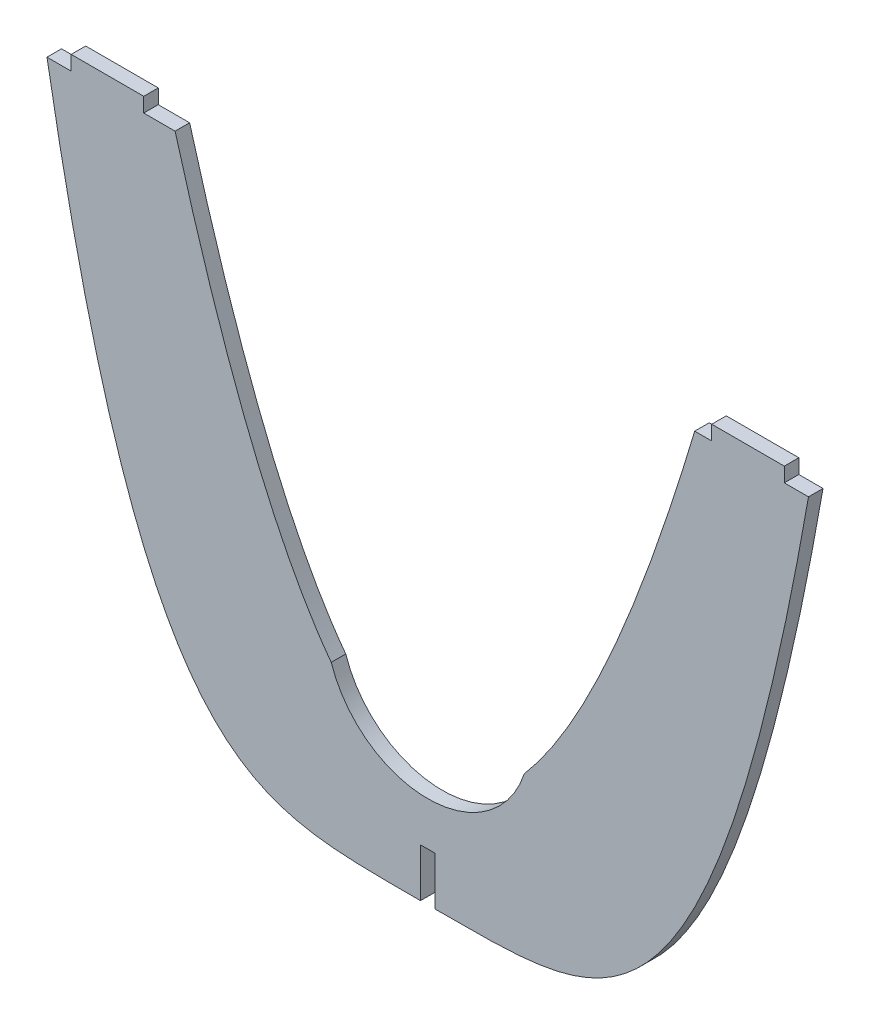
ISO-10303-21;
HEADER;
FILE_DESCRIPTION(('STEP AP214'),'2;1');
FILE_NAME('part.step','',(''),(''),'','','');
FILE_SCHEMA(('AUTOMOTIVE_DESIGN { 1 0 10303 214 1 1 1 1 }'));
ENDSEC;
DATA;
#1=APPLICATION_CONTEXT('core data for automotive mechanical design processes');
#2=APPLICATION_PROTOCOL_DEFINITION('international standard','automotive_design',2000,#1);
#3=PRODUCT_CONTEXT('',#1,'mechanical');
#4=PRODUCT('Part','Part','',(#3));
#5=PRODUCT_RELATED_PRODUCT_CATEGORY('part','',(#4));
#6=PRODUCT_DEFINITION_FORMATION('','',#4);
#7=PRODUCT_DEFINITION_CONTEXT('part definition',#1,'design');
#8=PRODUCT_DEFINITION('design','',#6,#7);
#9=PRODUCT_DEFINITION_SHAPE('','',#8);
#10=(LENGTH_UNIT() NAMED_UNIT(*) SI_UNIT(.MILLI.,.METRE.));
#11=(NAMED_UNIT(*) PLANE_ANGLE_UNIT() SI_UNIT($,.RADIAN.));
#12=(NAMED_UNIT(*) SI_UNIT($,.STERADIAN.) SOLID_ANGLE_UNIT());
#13=UNCERTAINTY_MEASURE_WITH_UNIT(LENGTH_MEASURE(1.E-05),#10,'distance_accuracy_value','');
#14=(GEOMETRIC_REPRESENTATION_CONTEXT(3) GLOBAL_UNCERTAINTY_ASSIGNED_CONTEXT((#13)) GLOBAL_UNIT_ASSIGNED_CONTEXT((#10,
#11,#12)) REPRESENTATION_CONTEXT('',''));
#15=CARTESIAN_POINT('',(0.,0.,0.));
#16=DIRECTION('',(0.,0.,1.));
#17=DIRECTION('',(1.,0.,0.));
#18=AXIS2_PLACEMENT_3D('',#15,#16,#17);
#19=CARTESIAN_POINT('',(-52.219973069775,112.388073674095,3.));
#20=CARTESIAN_POINT('',(-36.2958553968866,55.237212156312,3.));
#21=CARTESIAN_POINT('',(-19.9484089943407,33.4379135486869,3.));
#22=B_SPLINE_CURVE_WITH_KNOTS('',2,(#19,#20,#21),.UNSPECIFIED.,.F.,.F.,(3,3),(0.,
0.309282852156693),.UNSPECIFIED.);
#23=DIRECTION('',(0.,0.,-1.));
#24=VECTOR('',#23,1.);
#25=SURFACE_OF_LINEAR_EXTRUSION('',#22,#24);
#26=CARTESIAN_POINT('',(-52.219973069775,112.388073674095,0.));
#27=CARTESIAN_POINT('',(-36.2958553968866,55.237212156312,0.));
#28=CARTESIAN_POINT('',(-19.9484089943407,33.4379135486869,0.));
#29=B_SPLINE_CURVE_WITH_KNOTS('',2,(#26,#27,#28),.UNSPECIFIED.,.F.,.F.,(3,3),(0.,
0.309282852156693),.UNSPECIFIED.);
#30=CARTESIAN_POINT('',(-52.219973069775,112.388073674095,0.));
#31=VERTEX_POINT('',#30);
#32=CARTESIAN_POINT('',(-19.9484089943407,33.4379135486869,0.));
#33=VERTEX_POINT('',#32);
#34=EDGE_CURVE('E356',#31,#33,#29,.T.);
#35=ORIENTED_EDGE('',*,*,#34,.F.);
#36=DIRECTION('',(0.,0.,-1.));
#37=VECTOR('',#36,1.);
#38=CARTESIAN_POINT('',(-52.219973069775,112.388073674095,3.));
#39=LINE('',#38,#37);
#40=CARTESIAN_POINT('',(-52.219973069775,112.388073674095,3.));
#41=VERTEX_POINT('',#40);
#42=EDGE_CURVE('E11',#41,#31,#39,.T.);
#43=ORIENTED_EDGE('',*,*,#42,.F.);
#44=CARTESIAN_POINT('',(-19.9484089943407,33.4379135486869,3.));
#45=VERTEX_POINT('',#44);
#46=EDGE_CURVE('E294',#41,#45,#22,.T.);
#47=ORIENTED_EDGE('',*,*,#46,.T.);
#48=DIRECTION('',(0.,0.,-1.));
#49=VECTOR('',#48,1.);
#50=CARTESIAN_POINT('',(-19.9484089943407,33.4379135486869,3.));
#51=LINE('',#50,#49);
#52=EDGE_CURVE('E63',#45,#33,#51,.T.);
#53=ORIENTED_EDGE('',*,*,#52,.T.);
#54=EDGE_LOOP('',(#35,#43,#47,#53));
#55=FACE_BOUND('',#54,.T.);
#56=ADVANCED_FACE('F45',(#55),#25,.T.);
#57=CARTESIAN_POINT('',(0.,112.388073674095,3.));
#58=DIRECTION('',(0.,1.,0.));
#59=DIRECTION('',(0.,0.,1.));
#60=AXIS2_PLACEMENT_3D('',#57,#58,#59);
#61=PLANE('',#60);
#62=DIRECTION('',(1.,0.,0.));
#63=VECTOR('',#62,1.);
#64=CARTESIAN_POINT('',(0.,112.388073674095,0.));
#65=LINE('',#64,#63);
#66=CARTESIAN_POINT('',(-58.6999999755918,112.388073674095,0.));
#67=VERTEX_POINT('',#66);
#68=EDGE_CURVE('E352',#67,#31,#65,.T.);
#69=ORIENTED_EDGE('',*,*,#68,.F.);
#70=DIRECTION('',(0.,0.,-1.));
#71=VECTOR('',#70,1.);
#72=CARTESIAN_POINT('',(-58.6999999755918,112.388073674095,3.));
#73=LINE('',#72,#71);
#74=CARTESIAN_POINT('',(-58.6999999755918,112.388073674095,3.));
#75=VERTEX_POINT('',#74);
#76=EDGE_CURVE('E55',#75,#67,#73,.T.);
#77=ORIENTED_EDGE('',*,*,#76,.F.);
#78=DIRECTION('',(1.,0.,0.));
#79=VECTOR('',#78,1.);
#80=CARTESIAN_POINT('',(0.,112.388073674095,3.));
#81=LINE('',#80,#79);
#82=EDGE_CURVE('E290',#75,#41,#81,.T.);
#83=ORIENTED_EDGE('',*,*,#82,.T.);
#84=ORIENTED_EDGE('',*,*,#42,.T.);
#85=EDGE_LOOP('',(#69,#77,#83,#84));
#86=FACE_BOUND('',#85,.T.);
#87=ADVANCED_FACE('F433',(#86),#61,.T.);
#88=CARTESIAN_POINT('',(-58.6999999755918,0.,3.));
#89=DIRECTION('',(1.,0.,0.));
#90=DIRECTION('',(0.,0.,-1.));
#91=AXIS2_PLACEMENT_3D('',#88,#89,#90);
#92=PLANE('',#91);
#93=DIRECTION('',(0.,-1.,0.));
#94=VECTOR('',#93,1.);
#95=CARTESIAN_POINT('',(-58.6999999755918,0.,0.));
#96=LINE('',#95,#94);
#97=CARTESIAN_POINT('',(-58.6999999755918,115.38807359485,0.));
#98=VERTEX_POINT('',#97);
#99=EDGE_CURVE('E348',#98,#67,#96,.T.);
#100=ORIENTED_EDGE('',*,*,#99,.F.);
#101=DIRECTION('',(0.,0.,-1.));
#102=VECTOR('',#101,1.);
#103=CARTESIAN_POINT('',(-58.6999999755918,115.38807359485,3.));
#104=LINE('',#103,#102);
#105=CARTESIAN_POINT('',(-58.6999999755918,115.38807359485,3.));
#106=VERTEX_POINT('',#105);
#107=EDGE_CURVE('E423',#106,#98,#104,.T.);
#108=ORIENTED_EDGE('',*,*,#107,.F.);
#109=DIRECTION('',(0.,-1.,0.));
#110=VECTOR('',#109,1.);
#111=CARTESIAN_POINT('',(-58.6999999755918,0.,3.));
#112=LINE('',#111,#110);
#113=EDGE_CURVE('E286',#106,#75,#112,.T.);
#114=ORIENTED_EDGE('',*,*,#113,.T.);
#115=ORIENTED_EDGE('',*,*,#76,.T.);
#116=EDGE_LOOP('',(#100,#108,#114,#115));
#117=FACE_BOUND('',#116,.T.);
#118=ADVANCED_FACE('F429',(#117),#92,.T.);
#119=CARTESIAN_POINT('',(0.,115.38807359485,3.));
#120=DIRECTION('',(0.,1.,0.));
#121=DIRECTION('',(0.,0.,1.));
#122=AXIS2_PLACEMENT_3D('',#119,#120,#121);
#123=PLANE('',#122);
#124=DIRECTION('',(1.,0.,0.));
#125=VECTOR('',#124,1.);
#126=CARTESIAN_POINT('',(0.,115.38807359485,0.));
#127=LINE('',#126,#125);
#128=CARTESIAN_POINT('',(-73.6999999755918,115.38807359485,0.));
#129=VERTEX_POINT('',#128);
#130=EDGE_CURVE('E344',#129,#98,#127,.T.);
#131=ORIENTED_EDGE('',*,*,#130,.F.);
#132=DIRECTION('',(0.,0.,-1.));
#133=VECTOR('',#132,1.);
#134=CARTESIAN_POINT('',(-73.6999999755918,115.38807359485,3.));
#135=LINE('',#134,#133);
#136=CARTESIAN_POINT('',(-73.6999999755918,115.38807359485,3.));
#137=VERTEX_POINT('',#136);
#138=EDGE_CURVE('E420',#137,#129,#135,.T.);
#139=ORIENTED_EDGE('',*,*,#138,.F.);
#140=DIRECTION('',(1.,0.,0.));
#141=VECTOR('',#140,1.);
#142=CARTESIAN_POINT('',(0.,115.38807359485,3.));
#143=LINE('',#142,#141);
#144=EDGE_CURVE('E282',#137,#106,#143,.T.);
#145=ORIENTED_EDGE('',*,*,#144,.T.);
#146=ORIENTED_EDGE('',*,*,#107,.T.);
#147=EDGE_LOOP('',(#131,#139,#145,#146));
#148=FACE_BOUND('',#147,.T.);
#149=ADVANCED_FACE('F438',(#148),#123,.T.);
#150=CARTESIAN_POINT('',(-73.6999999755918,0.,3.));
#151=DIRECTION('',(-1.,0.,0.));
#152=DIRECTION('',(0.,0.,1.));
#153=AXIS2_PLACEMENT_3D('',#150,#151,#152);
#154=PLANE('',#153);
#155=DIRECTION('',(0.,1.,0.));
#156=VECTOR('',#155,1.);
#157=CARTESIAN_POINT('',(-73.6999999755918,0.,0.));
#158=LINE('',#157,#156);
#159=CARTESIAN_POINT('',(-73.6999999755918,112.388073589954,0.));
#160=VERTEX_POINT('',#159);
#161=EDGE_CURVE('E340',#160,#129,#158,.T.);
#162=ORIENTED_EDGE('',*,*,#161,.F.);
#163=DIRECTION('',(0.,0.,-1.));
#164=VECTOR('',#163,1.);
#165=CARTESIAN_POINT('',(-73.6999999755918,112.388073589954,3.));
#166=LINE('',#165,#164);
#167=CARTESIAN_POINT('',(-73.6999999755918,112.388073589954,3.));
#168=VERTEX_POINT('',#167);
#169=EDGE_CURVE('E417',#168,#160,#166,.T.);
#170=ORIENTED_EDGE('',*,*,#169,.F.);
#171=DIRECTION('',(0.,1.,0.));
#172=VECTOR('',#171,1.);
#173=CARTESIAN_POINT('',(-73.6999999755918,0.,3.));
#174=LINE('',#173,#172);
#175=EDGE_CURVE('E278',#168,#137,#174,.T.);
#176=ORIENTED_EDGE('',*,*,#175,.T.);
#177=ORIENTED_EDGE('',*,*,#138,.T.);
#178=EDGE_LOOP('',(#162,#170,#176,#177));
#179=FACE_BOUND('',#178,.T.);
#180=ADVANCED_FACE('F452',(#179),#154,.T.);
#181=CARTESIAN_POINT('',(0.,112.388073589954,3.));
#182=DIRECTION('',(0.,1.,0.));
#183=DIRECTION('',(0.,0.,1.));
#184=AXIS2_PLACEMENT_3D('',#181,#182,#183);
#185=PLANE('',#184);
#186=DIRECTION('',(1.,0.,0.));
#187=VECTOR('',#186,1.);
#188=CARTESIAN_POINT('',(0.,112.388073589954,0.));
#189=LINE('',#188,#187);
#190=CARTESIAN_POINT('',(-78.6999999740493,112.388073589954,0.));
#191=VERTEX_POINT('',#190);
#192=EDGE_CURVE('E336',#191,#160,#189,.T.);
#193=ORIENTED_EDGE('',*,*,#192,.F.);
#194=DIRECTION('',(0.,0.,-1.));
#195=VECTOR('',#194,1.);
#196=CARTESIAN_POINT('',(-78.6999999740493,112.388073589954,3.));
#197=LINE('',#196,#195);
#198=CARTESIAN_POINT('',(-78.6999999740493,112.388073589954,3.));
#199=VERTEX_POINT('',#198);
#200=EDGE_CURVE('E414',#199,#191,#197,.T.);
#201=ORIENTED_EDGE('',*,*,#200,.F.);
#202=DIRECTION('',(1.,0.,0.));
#203=VECTOR('',#202,1.);
#204=CARTESIAN_POINT('',(0.,112.388073589954,3.));
#205=LINE('',#204,#203);
#206=EDGE_CURVE('E274',#199,#168,#205,.T.);
#207=ORIENTED_EDGE('',*,*,#206,.T.);
#208=ORIENTED_EDGE('',*,*,#169,.T.);
#209=EDGE_LOOP('',(#193,#201,#207,#208));
#210=FACE_BOUND('',#209,.T.);
#211=ADVANCED_FACE('F455',(#210),#185,.T.);
#212=CARTESIAN_POINT('',(-78.6999999737066,112.388073587997,3.));
#213=CARTESIAN_POINT('',(-39.3500001700806,-112.388073408557,3.));
#214=CARTESIAN_POINT('',(1.62639866851944E-10,112.388073588461,3.));
#215=CARTESIAN_POINT('',(39.3499998037887,-112.388073537384,3.));
#216=CARTESIAN_POINT('',(78.6999999740319,112.388073588926,3.));
#217=B_SPLINE_CURVE_WITH_KNOTS('',4,(#212,#213,#214,#215,#216),.UNSPECIFIED.,.F.,.F.,(5,5),
(0.0292510885676566,0.970748911567731),.UNSPECIFIED.);
#218=DIRECTION('',(0.,0.,-1.));
#219=VECTOR('',#218,1.);
#220=SURFACE_OF_LINEAR_EXTRUSION('',#217,#219);
#221=CARTESIAN_POINT('',(-78.6999999737066,112.388073587997,0.));
#222=CARTESIAN_POINT('',(-39.3500001700806,-112.388073408557,0.));
#223=CARTESIAN_POINT('',(1.62639866851944E-10,112.388073588461,0.));
#224=CARTESIAN_POINT('',(39.3499998037887,-112.388073537384,0.));
#225=CARTESIAN_POINT('',(78.6999999740319,112.388073588926,0.));
#226=B_SPLINE_CURVE_WITH_KNOTS('',4,(#221,#222,#223,#224,#225),.UNSPECIFIED.,.F.,.F.,(5,5),
(0.0292510885676566,0.970748911567731),.UNSPECIFIED.);
#227=CARTESIAN_POINT('',(-1.49999999999998,1.48909808106199E-05,0.));
#228=VERTEX_POINT('',#227);
#229=EDGE_CURVE('E332',#191,#228,#226,.T.);
#230=ORIENTED_EDGE('',*,*,#229,.T.);
#231=DIRECTION('',(0.,0.,-1.));
#232=VECTOR('',#231,1.);
#233=CARTESIAN_POINT('',(-1.49999999999998,1.48909808106199E-05,3.));
#234=LINE('',#233,#232);
#235=CARTESIAN_POINT('',(-1.49999999999998,1.48909808106199E-05,3.));
#236=VERTEX_POINT('',#235);
#237=EDGE_CURVE('E411',#236,#228,#234,.T.);
#238=ORIENTED_EDGE('',*,*,#237,.F.);
#239=EDGE_CURVE('E271',#199,#236,#217,.T.);
#240=ORIENTED_EDGE('',*,*,#239,.F.);
#241=ORIENTED_EDGE('',*,*,#200,.T.);
#242=EDGE_LOOP('',(#230,#238,#240,#241));
#243=FACE_BOUND('',#242,.T.);
#244=ADVANCED_FACE('F459',(#243),#220,.F.);
#245=CARTESIAN_POINT('',(-1.49999999999998,0.,3.));
#246=DIRECTION('',(1.,0.,0.));
#247=DIRECTION('',(0.,1.,0.));
#248=AXIS2_PLACEMENT_3D('',#245,#246,#247);
#249=PLANE('',#248);
#250=DIRECTION('',(0.,-1.,0.));
#251=VECTOR('',#250,1.);
#252=CARTESIAN_POINT('',(-1.49999999999998,0.,0.));
#253=LINE('',#252,#251);
#254=CARTESIAN_POINT('',(-1.5,10.,0.));
#255=VERTEX_POINT('',#254);
#256=EDGE_CURVE('E328',#255,#228,#253,.T.);
#257=ORIENTED_EDGE('',*,*,#256,.F.);
#258=DIRECTION('',(0.,0.,-1.));
#259=VECTOR('',#258,1.);
#260=CARTESIAN_POINT('',(-1.5,10.,3.));
#261=LINE('',#260,#259);
#262=CARTESIAN_POINT('',(-1.5,10.,3.));
#263=VERTEX_POINT('',#262);
#264=EDGE_CURVE('E408',#263,#255,#261,.T.);
#265=ORIENTED_EDGE('',*,*,#264,.F.);
#266=DIRECTION('',(0.,-1.,0.));
#267=VECTOR('',#266,1.);
#268=CARTESIAN_POINT('',(-1.49999999999998,0.,3.));
#269=LINE('',#268,#267);
#270=EDGE_CURVE('E268',#263,#236,#269,.T.);
#271=ORIENTED_EDGE('',*,*,#270,.T.);
#272=ORIENTED_EDGE('',*,*,#237,.T.);
#273=EDGE_LOOP('',(#257,#265,#271,#272));
#274=FACE_BOUND('',#273,.T.);
#275=ADVANCED_FACE('F463',(#274),#249,.T.);
#276=CARTESIAN_POINT('',(0.,10.,3.));
#277=DIRECTION('',(0.,-1.,0.));
#278=DIRECTION('',(0.,0.,-1.));
#279=AXIS2_PLACEMENT_3D('',#276,#277,#278);
#280=PLANE('',#279);
#281=DIRECTION('',(-1.,0.,0.));
#282=VECTOR('',#281,1.);
#283=CARTESIAN_POINT('',(0.,10.,0.));
#284=LINE('',#283,#282);
#285=CARTESIAN_POINT('',(1.5,10.,0.));
#286=VERTEX_POINT('',#285);
#287=EDGE_CURVE('E324',#286,#255,#284,.T.);
#288=ORIENTED_EDGE('',*,*,#287,.F.);
#289=DIRECTION('',(0.,0.,-1.));
#290=VECTOR('',#289,1.);
#291=CARTESIAN_POINT('',(1.5,10.,3.));
#292=LINE('',#291,#290);
#293=CARTESIAN_POINT('',(1.5,10.,3.));
#294=VERTEX_POINT('',#293);
#295=EDGE_CURVE('E405',#294,#286,#292,.T.);
#296=ORIENTED_EDGE('',*,*,#295,.F.);
#297=DIRECTION('',(-1.,0.,0.));
#298=VECTOR('',#297,1.);
#299=CARTESIAN_POINT('',(0.,10.,3.));
#300=LINE('',#299,#298);
#301=EDGE_CURVE('E265',#294,#263,#300,.T.);
#302=ORIENTED_EDGE('',*,*,#301,.T.);
#303=ORIENTED_EDGE('',*,*,#264,.T.);
#304=EDGE_LOOP('',(#288,#296,#302,#303));
#305=FACE_BOUND('',#304,.T.);
#306=ADVANCED_FACE('F478',(#305),#280,.T.);
#307=CARTESIAN_POINT('',(1.5,0.,3.));
#308=DIRECTION('',(-1.,0.,0.));
#309=DIRECTION('',(0.,0.,1.));
#310=AXIS2_PLACEMENT_3D('',#307,#308,#309);
#311=PLANE('',#310);
#312=DIRECTION('',(0.,1.,0.));
#313=VECTOR('',#312,1.);
#314=CARTESIAN_POINT('',(1.5,0.,0.));
#315=LINE('',#314,#313);
#316=CARTESIAN_POINT('',(1.5,1.4888069006015E-05,0.));
#317=VERTEX_POINT('',#316);
#318=EDGE_CURVE('E320',#317,#286,#315,.T.);
#319=ORIENTED_EDGE('',*,*,#318,.F.);
#320=DIRECTION('',(0.,0.,-1.));
#321=VECTOR('',#320,1.);
#322=CARTESIAN_POINT('',(1.5,1.4888069006015E-05,3.));
#323=LINE('',#322,#321);
#324=CARTESIAN_POINT('',(1.5,1.4888069006015E-05,3.));
#325=VERTEX_POINT('',#324);
#326=EDGE_CURVE('E402',#325,#317,#323,.T.);
#327=ORIENTED_EDGE('',*,*,#326,.F.);
#328=DIRECTION('',(0.,1.,0.));
#329=VECTOR('',#328,1.);
#330=CARTESIAN_POINT('',(1.5,0.,3.));
#331=LINE('',#330,#329);
#332=EDGE_CURVE('E249',#325,#294,#331,.T.);
#333=ORIENTED_EDGE('',*,*,#332,.T.);
#334=ORIENTED_EDGE('',*,*,#295,.T.);
#335=EDGE_LOOP('',(#319,#327,#333,#334));
#336=FACE_BOUND('',#335,.T.);
#337=ADVANCED_FACE('F238',(#336),#311,.T.);
#338=CARTESIAN_POINT('',(-78.6999999737066,112.388073587997,3.));
#339=CARTESIAN_POINT('',(-39.3500001700806,-112.388073408557,3.));
#340=CARTESIAN_POINT('',(1.62639866851944E-10,112.388073588461,3.));
#341=CARTESIAN_POINT('',(39.3499998037887,-112.388073537384,3.));
#342=CARTESIAN_POINT('',(78.6999999740319,112.388073588926,3.));
#343=B_SPLINE_CURVE_WITH_KNOTS('',4,(#338,#339,#340,#341,#342),.UNSPECIFIED.,.F.,.F.,(5,5),
(0.0292510885676566,0.970748911567731),.UNSPECIFIED.);
#344=DIRECTION('',(0.,0.,-1.));
#345=VECTOR('',#344,1.);
#346=SURFACE_OF_LINEAR_EXTRUSION('',#343,#345);
#347=CARTESIAN_POINT('',(-78.6999999737066,112.388073587997,0.));
#348=CARTESIAN_POINT('',(-39.3500001700806,-112.388073408557,0.));
#349=CARTESIAN_POINT('',(1.62639866851944E-10,112.388073588461,0.));
#350=CARTESIAN_POINT('',(39.3499998037887,-112.388073537384,0.));
#351=CARTESIAN_POINT('',(78.6999999740319,112.388073588926,0.));
#352=B_SPLINE_CURVE_WITH_KNOTS('',4,(#347,#348,#349,#350,#351),.UNSPECIFIED.,.F.,.F.,(5,5),
(0.0292510885676566,0.970748911567731),.UNSPECIFIED.);
#353=CARTESIAN_POINT('',(78.6999999740493,112.388073589954,0.));
#354=VERTEX_POINT('',#353);
#355=EDGE_CURVE('E317',#317,#354,#352,.T.);
#356=ORIENTED_EDGE('',*,*,#355,.T.);
#357=DIRECTION('',(0.,0.,-1.));
#358=VECTOR('',#357,1.);
#359=CARTESIAN_POINT('',(78.6999999740493,112.388073589954,3.));
#360=LINE('',#359,#358);
#361=CARTESIAN_POINT('',(78.6999999740493,112.388073589954,3.));
#362=VERTEX_POINT('',#361);
#363=EDGE_CURVE('E398',#362,#354,#360,.T.);
#364=ORIENTED_EDGE('',*,*,#363,.F.);
#365=EDGE_CURVE('E241',#325,#362,#343,.T.);
#366=ORIENTED_EDGE('',*,*,#365,.F.);
#367=ORIENTED_EDGE('',*,*,#326,.T.);
#368=EDGE_LOOP('',(#356,#364,#366,#367));
#369=FACE_BOUND('',#368,.T.);
#370=ADVANCED_FACE('F233',(#369),#346,.F.);
#371=CARTESIAN_POINT('',(0.,112.388073589954,3.));
#372=DIRECTION('',(0.,-1.,0.));
#373=DIRECTION('',(0.,0.,-1.));
#374=AXIS2_PLACEMENT_3D('',#371,#372,#373);
#375=PLANE('',#374);
#376=DIRECTION('',(-1.,0.,0.));
#377=VECTOR('',#376,1.);
#378=CARTESIAN_POINT('',(0.,112.388073589954,0.));
#379=LINE('',#378,#377);
#380=CARTESIAN_POINT('',(73.6999999755918,112.388073589954,0.));
#381=VERTEX_POINT('',#380);
#382=EDGE_CURVE('E314',#354,#381,#379,.T.);
#383=ORIENTED_EDGE('',*,*,#382,.T.);
#384=DIRECTION('',(0.,0.,-1.));
#385=VECTOR('',#384,1.);
#386=CARTESIAN_POINT('',(73.6999999755918,112.388073589954,3.));
#387=LINE('',#386,#385);
#388=CARTESIAN_POINT('',(73.6999999755918,112.388073589954,3.));
#389=VERTEX_POINT('',#388);
#390=EDGE_CURVE('E394',#389,#381,#387,.T.);
#391=ORIENTED_EDGE('',*,*,#390,.F.);
#392=DIRECTION('',(-1.,0.,0.));
#393=VECTOR('',#392,1.);
#394=CARTESIAN_POINT('',(0.,112.388073589954,3.));
#395=LINE('',#394,#393);
#396=EDGE_CURVE('E248',#362,#389,#395,.T.);
#397=ORIENTED_EDGE('',*,*,#396,.F.);
#398=ORIENTED_EDGE('',*,*,#363,.T.);
#399=EDGE_LOOP('',(#383,#391,#397,#398));
#400=FACE_BOUND('',#399,.T.);
#401=ADVANCED_FACE('F229',(#400),#375,.F.);
#402=CARTESIAN_POINT('',(73.6999999755918,0.,3.));
#403=DIRECTION('',(-1.,0.,0.));
#404=DIRECTION('',(0.,0.,1.));
#405=AXIS2_PLACEMENT_3D('',#402,#403,#404);
#406=PLANE('',#405);
#407=DIRECTION('',(0.,1.,0.));
#408=VECTOR('',#407,1.);
#409=CARTESIAN_POINT('',(73.6999999755918,0.,0.));
#410=LINE('',#409,#408);
#411=CARTESIAN_POINT('',(73.6999999755918,115.38807370853,0.));
#412=VERTEX_POINT('',#411);
#413=EDGE_CURVE('E311',#381,#412,#410,.T.);
#414=ORIENTED_EDGE('',*,*,#413,.T.);
#415=DIRECTION('',(0.,0.,-1.));
#416=VECTOR('',#415,1.);
#417=CARTESIAN_POINT('',(73.6999999755918,115.38807370853,3.));
#418=LINE('',#417,#416);
#419=CARTESIAN_POINT('',(73.6999999755918,115.38807370853,3.));
#420=VERTEX_POINT('',#419);
#421=EDGE_CURVE('E390',#420,#412,#418,.T.);
#422=ORIENTED_EDGE('',*,*,#421,.F.);
#423=DIRECTION('',(0.,1.,0.));
#424=VECTOR('',#423,1.);
#425=CARTESIAN_POINT('',(73.6999999755918,0.,3.));
#426=LINE('',#425,#424);
#427=EDGE_CURVE('E256',#389,#420,#426,.T.);
#428=ORIENTED_EDGE('',*,*,#427,.F.);
#429=ORIENTED_EDGE('',*,*,#390,.T.);
#430=EDGE_LOOP('',(#414,#422,#428,#429));
#431=FACE_BOUND('',#430,.T.);
#432=ADVANCED_FACE('F225',(#431),#406,.F.);
#433=CARTESIAN_POINT('',(-1.06755413498629E-13,115.38807370853,3.));
#434=DIRECTION('',(0.,-1.,0.));
#435=DIRECTION('',(1.,0.,0.));
#436=AXIS2_PLACEMENT_3D('',#433,#434,#435);
#437=PLANE('',#436);
#438=DIRECTION('',(-1.,0.,0.));
#439=VECTOR('',#438,1.);
#440=CARTESIAN_POINT('',(-1.06755413498629E-13,115.38807370853,0.));
#441=LINE('',#440,#439);
#442=CARTESIAN_POINT('',(58.6999999755918,115.38807370853,0.));
#443=VERTEX_POINT('',#442);
#444=EDGE_CURVE('E308',#412,#443,#441,.T.);
#445=ORIENTED_EDGE('',*,*,#444,.T.);
#446=DIRECTION('',(0.,0.,-1.));
#447=VECTOR('',#446,1.);
#448=CARTESIAN_POINT('',(58.6999999755918,115.38807370853,3.));
#449=LINE('',#448,#447);
#450=CARTESIAN_POINT('',(58.6999999755918,115.38807370853,3.));
#451=VERTEX_POINT('',#450);
#452=EDGE_CURVE('E386',#451,#443,#449,.T.);
#453=ORIENTED_EDGE('',*,*,#452,.F.);
#454=DIRECTION('',(-1.,0.,0.));
#455=VECTOR('',#454,1.);
#456=CARTESIAN_POINT('',(-1.06755413498629E-13,115.38807370853,3.));
#457=LINE('',#456,#455);
#458=EDGE_CURVE('E259',#420,#451,#457,.T.);
#459=ORIENTED_EDGE('',*,*,#458,.F.);
#460=ORIENTED_EDGE('',*,*,#421,.T.);
#461=EDGE_LOOP('',(#445,#453,#459,#460));
#462=FACE_BOUND('',#461,.T.);
#463=ADVANCED_FACE('F221',(#462),#437,.F.);
#464=CARTESIAN_POINT('',(58.6999999755918,0.,3.));
#465=DIRECTION('',(1.,0.,0.));
#466=DIRECTION('',(0.,0.,-1.));
#467=AXIS2_PLACEMENT_3D('',#464,#465,#466);
#468=PLANE('',#467);
#469=DIRECTION('',(0.,-1.,0.));
#470=VECTOR('',#469,1.);
#471=CARTESIAN_POINT('',(58.6999999755918,0.,0.));
#472=LINE('',#471,#470);
#473=CARTESIAN_POINT('',(58.6999999755918,112.38807370853,0.));
#474=VERTEX_POINT('',#473);
#475=EDGE_CURVE('E305',#443,#474,#472,.T.);
#476=ORIENTED_EDGE('',*,*,#475,.T.);
#477=DIRECTION('',(0.,0.,-1.));
#478=VECTOR('',#477,1.);
#479=CARTESIAN_POINT('',(58.6999999755918,112.38807370853,3.));
#480=LINE('',#479,#478);
#481=CARTESIAN_POINT('',(58.6999999755918,112.38807370853,3.));
#482=VERTEX_POINT('',#481);
#483=EDGE_CURVE('E194',#482,#474,#480,.T.);
#484=ORIENTED_EDGE('',*,*,#483,.F.);
#485=DIRECTION('',(0.,-1.,0.));
#486=VECTOR('',#485,1.);
#487=CARTESIAN_POINT('',(58.6999999755918,0.,3.));
#488=LINE('',#487,#486);
#489=EDGE_CURVE('E180',#451,#482,#488,.T.);
#490=ORIENTED_EDGE('',*,*,#489,.F.);
#491=ORIENTED_EDGE('',*,*,#452,.T.);
#492=EDGE_LOOP('',(#476,#484,#490,#491));
#493=FACE_BOUND('',#492,.T.);
#494=ADVANCED_FACE('F218',(#493),#468,.F.);
#495=CARTESIAN_POINT('',(-4.43099367720126E-13,112.38807370853,3.));
#496=DIRECTION('',(0.,-1.,0.));
#497=DIRECTION('',(1.,0.,0.));
#498=AXIS2_PLACEMENT_3D('',#495,#496,#497);
#499=PLANE('',#498);
#500=DIRECTION('',(-1.,0.,0.));
#501=VECTOR('',#500,1.);
#502=CARTESIAN_POINT('',(-4.43099367720126E-13,112.38807370853,0.));
#503=LINE('',#502,#501);
#504=CARTESIAN_POINT('',(55.1800269115789,112.38807370853,0.));
#505=VERTEX_POINT('',#504);
#506=EDGE_CURVE('E190',#474,#505,#503,.T.);
#507=ORIENTED_EDGE('',*,*,#506,.T.);
#508=DIRECTION('',(0.,0.,-1.));
#509=VECTOR('',#508,1.);
#510=CARTESIAN_POINT('',(55.1800269115789,112.38807370853,3.));
#511=LINE('',#510,#509);
#512=CARTESIAN_POINT('',(55.1800269115789,112.38807370853,3.));
#513=VERTEX_POINT('',#512);
#514=EDGE_CURVE('E187',#513,#505,#511,.T.);
#515=ORIENTED_EDGE('',*,*,#514,.F.);
#516=DIRECTION('',(-1.,0.,0.));
#517=VECTOR('',#516,1.);
#518=CARTESIAN_POINT('',(-4.43099367720126E-13,112.38807370853,3.));
#519=LINE('',#518,#517);
#520=EDGE_CURVE('E173',#482,#513,#519,.T.);
#521=ORIENTED_EDGE('',*,*,#520,.F.);
#522=ORIENTED_EDGE('',*,*,#483,.T.);
#523=EDGE_LOOP('',(#507,#515,#521,#522));
#524=FACE_BOUND('',#523,.T.);
#525=ADVANCED_FACE('F188',(#524),#499,.F.);
#526=CARTESIAN_POINT('',(19.9484089943407,33.4379135486869,3.));
#527=CARTESIAN_POINT('',(37.8534079657996,54.2419705438516,3.));
#528=CARTESIAN_POINT('',(55.1800269115789,112.38807370853,3.));
#529=B_SPLINE_CURVE_WITH_KNOTS('',2,(#526,#527,#528),.UNSPECIFIED.,.F.,.F.,(3,3),
(0.671212773519278,1.),.UNSPECIFIED.);
#530=DIRECTION('',(0.,0.,-1.));
#531=VECTOR('',#530,1.);
#532=SURFACE_OF_LINEAR_EXTRUSION('',#529,#531);
#533=CARTESIAN_POINT('',(19.9484089943407,33.4379135486869,0.));
#534=CARTESIAN_POINT('',(37.8534079657996,54.2419705438516,0.));
#535=CARTESIAN_POINT('',(55.1800269115789,112.38807370853,0.));
#536=B_SPLINE_CURVE_WITH_KNOTS('',2,(#533,#534,#535),.UNSPECIFIED.,.F.,.F.,(3,3),
(0.671212773519278,1.),.UNSPECIFIED.);
#537=CARTESIAN_POINT('',(19.9484089943407,33.4379135486869,0.));
#538=VERTEX_POINT('',#537);
#539=EDGE_CURVE('E300',#538,#505,#536,.T.);
#540=ORIENTED_EDGE('',*,*,#539,.F.);
#541=DIRECTION('',(0.,0.,-1.));
#542=VECTOR('',#541,1.);
#543=CARTESIAN_POINT('',(19.9484089943407,33.4379135486869,3.));
#544=LINE('',#543,#542);
#545=CARTESIAN_POINT('',(19.9484089943407,33.4379135486869,3.));
#546=VERTEX_POINT('',#545);
#547=EDGE_CURVE('E118',#546,#538,#544,.T.);
#548=ORIENTED_EDGE('',*,*,#547,.F.);
#549=EDGE_CURVE('E178',#546,#513,#529,.T.);
#550=ORIENTED_EDGE('',*,*,#549,.T.);
#551=ORIENTED_EDGE('',*,*,#514,.T.);
#552=EDGE_LOOP('',(#540,#548,#550,#551));
#553=FACE_BOUND('',#552,.T.);
#554=ADVANCED_FACE('F196',(#553),#532,.T.);
#555=CARTESIAN_POINT('',(0.,39.9999999999764,3.));
#556=DIRECTION('',(0.,0.,-1.));
#557=DIRECTION('',(-1.,0.,0.));
#558=AXIS2_PLACEMENT_3D('',#555,#556,#557);
#559=CYLINDRICAL_SURFACE('',#558,20.9999999999926);
#560=CARTESIAN_POINT('',(0.,39.9999999999764,0.));
#561=DIRECTION('',(0.,0.,1.));
#562=DIRECTION('',(1.,0.,0.));
#563=AXIS2_PLACEMENT_3D('',#560,#561,#562);
#564=CIRCLE('',#563,20.9999999999926);
#565=EDGE_CURVE('E297',#33,#538,#564,.T.);
#566=ORIENTED_EDGE('',*,*,#565,.F.);
#567=ORIENTED_EDGE('',*,*,#52,.F.);
#568=CARTESIAN_POINT('',(0.,39.9999999999764,3.));
#569=DIRECTION('',(0.,0.,1.));
#570=DIRECTION('',(1.,0.,0.));
#571=AXIS2_PLACEMENT_3D('',#568,#569,#570);
#572=CIRCLE('',#571,20.9999999999926);
#573=EDGE_CURVE('E198',#45,#546,#572,.T.);
#574=ORIENTED_EDGE('',*,*,#573,.T.);
#575=ORIENTED_EDGE('',*,*,#547,.T.);
#576=EDGE_LOOP('',(#566,#567,#574,#575));
#577=FACE_BOUND('',#576,.T.);
#578=ADVANCED_FACE('F214',(#577),#559,.F.);
#579=CARTESIAN_POINT('',(0.,0.,3.));
#580=DIRECTION('',(0.,0.,1.));
#581=DIRECTION('',(1.,0.,0.));
#582=AXIS2_PLACEMENT_3D('',#579,#580,#581);
#583=PLANE('',#582);
#584=ORIENTED_EDGE('',*,*,#46,.F.);
#585=ORIENTED_EDGE('',*,*,#82,.F.);
#586=ORIENTED_EDGE('',*,*,#113,.F.);
#587=ORIENTED_EDGE('',*,*,#144,.F.);
#588=ORIENTED_EDGE('',*,*,#175,.F.);
#589=ORIENTED_EDGE('',*,*,#206,.F.);
#590=ORIENTED_EDGE('',*,*,#239,.T.);
#591=ORIENTED_EDGE('',*,*,#270,.F.);
#592=ORIENTED_EDGE('',*,*,#301,.F.);
#593=ORIENTED_EDGE('',*,*,#332,.F.);
#594=ORIENTED_EDGE('',*,*,#365,.T.);
#595=ORIENTED_EDGE('',*,*,#396,.T.);
#596=ORIENTED_EDGE('',*,*,#427,.T.);
#597=ORIENTED_EDGE('',*,*,#458,.T.);
#598=ORIENTED_EDGE('',*,*,#489,.T.);
#599=ORIENTED_EDGE('',*,*,#520,.T.);
#600=ORIENTED_EDGE('',*,*,#549,.F.);
#601=ORIENTED_EDGE('',*,*,#573,.F.);
#602=EDGE_LOOP('',(#584,#585,#586,#587,#588,#589,#590,#591,#592,#593,#594,#595,#596,#597,#598,
#599,#600,#601));
#603=FACE_BOUND('',#602,.T.);
#604=ADVANCED_FACE('F175',(#603),#583,.T.);
#605=CARTESIAN_POINT('',(0.,0.,0.));
#606=DIRECTION('',(0.,0.,1.));
#607=DIRECTION('',(1.,0.,0.));
#608=AXIS2_PLACEMENT_3D('',#605,#606,#607);
#609=PLANE('',#608);
#610=ORIENTED_EDGE('',*,*,#34,.T.);
#611=ORIENTED_EDGE('',*,*,#565,.T.);
#612=ORIENTED_EDGE('',*,*,#539,.T.);
#613=ORIENTED_EDGE('',*,*,#506,.F.);
#614=ORIENTED_EDGE('',*,*,#475,.F.);
#615=ORIENTED_EDGE('',*,*,#444,.F.);
#616=ORIENTED_EDGE('',*,*,#413,.F.);
#617=ORIENTED_EDGE('',*,*,#382,.F.);
#618=ORIENTED_EDGE('',*,*,#355,.F.);
#619=ORIENTED_EDGE('',*,*,#318,.T.);
#620=ORIENTED_EDGE('',*,*,#287,.T.);
#621=ORIENTED_EDGE('',*,*,#256,.T.);
#622=ORIENTED_EDGE('',*,*,#229,.F.);
#623=ORIENTED_EDGE('',*,*,#192,.T.);
#624=ORIENTED_EDGE('',*,*,#161,.T.);
#625=ORIENTED_EDGE('',*,*,#130,.T.);
#626=ORIENTED_EDGE('',*,*,#99,.T.);
#627=ORIENTED_EDGE('',*,*,#68,.T.);
#628=EDGE_LOOP('',(#610,#611,#612,#613,#614,#615,#616,#617,#618,#619,#620,#621,#622,#623,#624,
#625,#626,#627));
#629=FACE_BOUND('',#628,.T.);
#630=ADVANCED_FACE('F434',(#629),#609,.F.);
#631=CLOSED_SHELL('',(#56,#87,#118,#149,#180,#211,#244,#275,#306,#337,#370,#401,#432,#463,#494,
#525,#554,#578,#604,#630));
#632=MANIFOLD_SOLID_BREP('B2',#631);
#633=ADVANCED_BREP_SHAPE_REPRESENTATION('',(#18,#632),#14);
#634=SHAPE_DEFINITION_REPRESENTATION(#9,#633);
ENDSEC;
END-ISO-10303-21;
